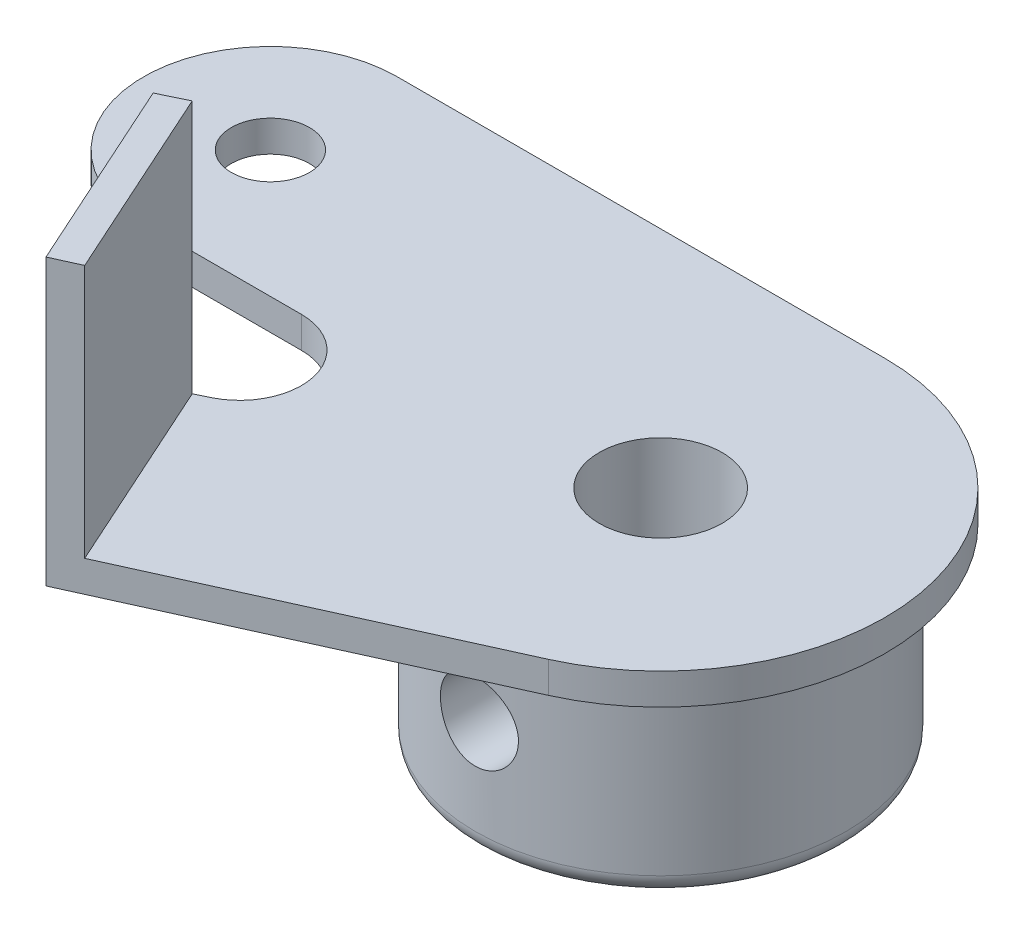
ISO-10303-21;
HEADER;
FILE_DESCRIPTION(('STEP AP214'),'2;1');
FILE_NAME('part.step','',(''),(''),'','','');
FILE_SCHEMA(('AUTOMOTIVE_DESIGN { 1 0 10303 214 1 1 1 1 }'));
ENDSEC;
DATA;
#1=APPLICATION_CONTEXT('core data for automotive mechanical design processes');
#2=APPLICATION_PROTOCOL_DEFINITION('international standard','automotive_design',2000,#1);
#3=PRODUCT_CONTEXT('',#1,'mechanical');
#4=PRODUCT('Part','Part','',(#3));
#5=PRODUCT_RELATED_PRODUCT_CATEGORY('part','',(#4));
#6=PRODUCT_DEFINITION_FORMATION('','',#4);
#7=PRODUCT_DEFINITION_CONTEXT('part definition',#1,'design');
#8=PRODUCT_DEFINITION('design','',#6,#7);
#9=PRODUCT_DEFINITION_SHAPE('','',#8);
#10=(LENGTH_UNIT() NAMED_UNIT(*) SI_UNIT(.MILLI.,.METRE.));
#11=(NAMED_UNIT(*) PLANE_ANGLE_UNIT() SI_UNIT($,.RADIAN.));
#12=(NAMED_UNIT(*) SI_UNIT($,.STERADIAN.) SOLID_ANGLE_UNIT());
#13=UNCERTAINTY_MEASURE_WITH_UNIT(LENGTH_MEASURE(1.E-05),#10,'distance_accuracy_value','');
#14=(GEOMETRIC_REPRESENTATION_CONTEXT(3) GLOBAL_UNCERTAINTY_ASSIGNED_CONTEXT((#13)) GLOBAL_UNIT_ASSIGNED_CONTEXT((#10,
#11,#12)) REPRESENTATION_CONTEXT('',''));
#15=CARTESIAN_POINT('',(0.,0.,0.));
#16=DIRECTION('',(0.,0.,1.));
#17=DIRECTION('',(1.,0.,0.));
#18=AXIS2_PLACEMENT_3D('',#15,#16,#17);
#19=CARTESIAN_POINT('',(0.,1.6,0.));
#20=DIRECTION('',(0.,-1.,0.));
#21=DIRECTION('',(0.,0.,-1.));
#22=AXIS2_PLACEMENT_3D('',#19,#20,#21);
#23=CYLINDRICAL_SURFACE('',#22,3.15);
#24=CARTESIAN_POINT('',(0.,-9.9,0.));
#25=DIRECTION('',(0.,1.,0.));
#26=DIRECTION('',(0.,0.,1.));
#27=AXIS2_PLACEMENT_3D('',#24,#25,#26);
#28=CIRCLE('',#27,3.15);
#29=CARTESIAN_POINT('',(0.,-9.9,3.15));
#30=VERTEX_POINT('',#29);
#31=EDGE_CURVE('E162',#30,#30,#28,.T.);
#32=ORIENTED_EDGE('',*,*,#31,.F.);
#33=EDGE_LOOP('',(#32));
#34=FACE_BOUND('',#33,.T.);
#35=CARTESIAN_POINT('',(0.,1.6,0.));
#36=DIRECTION('',(0.,1.,0.));
#37=DIRECTION('',(0.,0.,1.));
#38=AXIS2_PLACEMENT_3D('',#35,#36,#37);
#39=CIRCLE('',#38,3.15);
#40=CARTESIAN_POINT('',(0.,1.6,3.15));
#41=VERTEX_POINT('',#40);
#42=EDGE_CURVE('E170',#41,#41,#39,.T.);
#43=ORIENTED_EDGE('',*,*,#42,.T.);
#44=EDGE_LOOP('',(#43));
#45=FACE_BOUND('',#44,.T.);
#46=CARTESIAN_POINT('',(-2.,-4.,2.43361870472759));
#47=CARTESIAN_POINT('',(-1.99999048596303,-4.09897792412923,2.43363407140303));
#48=CARTESIAN_POINT('',(-1.99258494171125,-4.1980937936849,2.4397712297814));
#49=CARTESIAN_POINT('',(-1.96350941138464,-4.39293729178397,2.46321942053438));
#50=CARTESIAN_POINT('',(-1.94180331367139,-4.48865569450507,2.48055873835427));
#51=CARTESIAN_POINT('',(-1.88571217682298,-4.67329343053568,2.52345220456699));
#52=CARTESIAN_POINT('',(-1.851440143901,-4.76226508552795,2.5489328823773));
#53=CARTESIAN_POINT('',(-1.77151743183294,-4.93307511819181,2.60511197616351));
#54=CARTESIAN_POINT('',(-1.72586583679141,-5.01491292097222,2.6358108120648));
#55=CARTESIAN_POINT('',(-1.61708994740565,-5.18163300154651,2.70410628666589));
#56=CARTESIAN_POINT('',(-1.55241882997592,-5.26535664501788,2.74206853555775));
#57=CARTESIAN_POINT('',(-1.41059220491435,-5.42175437238425,2.81765858361404));
#58=CARTESIAN_POINT('',(-1.33342569379183,-5.49441860690431,2.85528605688028));
#59=CARTESIAN_POINT('',(-1.15704034741739,-5.63571807907852,2.93157022789516));
#60=CARTESIAN_POINT('',(-1.05626802714094,-5.70269215102644,2.96975927399976));
#61=CARTESIAN_POINT('',(-0.841996814394424,-5.81818709709045,3.03745228192605));
#62=CARTESIAN_POINT('',(-0.728511029226368,-5.86672675403408,3.0669650770146));
#63=CARTESIAN_POINT('',(-0.504499180886491,-5.9385134729046,3.11120961521296));
#64=CARTESIAN_POINT('',(-0.394895915515058,-5.96386827285645,3.12716069277187));
#65=CARTESIAN_POINT('',(-0.171964548656172,-5.99576167129526,3.14728504515542));
#66=CARTESIAN_POINT('',(-0.0586406758425458,-6.00232093093652,3.15147125251418));
#67=CARTESIAN_POINT('',(0.151552365513752,-5.99662936234425,3.1478620369092));
#68=CARTESIAN_POINT('',(0.248528717658883,-5.98685561615349,3.14164430808859));
#69=CARTESIAN_POINT('',(0.439138310744908,-5.95359030505218,3.12071260109803));
#70=CARTESIAN_POINT('',(0.532771299038607,-5.93009770577037,3.10599798228226));
#71=CARTESIAN_POINT('',(0.71448221653663,-5.87047576464673,3.06930433488698));
#72=CARTESIAN_POINT('',(0.802553648932606,-5.83433195506957,3.04731699091795));
#73=CARTESIAN_POINT('',(0.971433705071277,-5.75077179124807,2.9977610791413));
#74=CARTESIAN_POINT('',(1.05224075549125,-5.70335300313121,2.97019130647403));
#75=CARTESIAN_POINT('',(1.21525026488542,-5.5918894575377,2.90761365273554));
#76=CARTESIAN_POINT('',(1.29634063387077,-5.52650141596791,2.87210613999983));
#77=CARTESIAN_POINT('',(1.44710869319607,-5.3844238384735,2.79917994431847));
#78=CARTESIAN_POINT('',(1.51676911567106,-5.3077175294504,2.76175847971295));
#79=CARTESIAN_POINT('',(1.65238450119593,-5.13291104421371,2.68310715916129));
#80=CARTESIAN_POINT('',(1.71653615599839,-5.03331982460277,2.64205458619123));
#81=CARTESIAN_POINT('',(1.82699006644229,-4.82232618356503,2.56692053853577));
#82=CARTESIAN_POINT('',(1.87332485499188,-4.71094576777233,2.53282641194835));
#83=CARTESIAN_POINT('',(1.93594353840381,-4.50993207050804,2.48510313895072));
#84=CARTESIAN_POINT('',(1.95695691453044,-4.4224981757177,2.4684365697313));
#85=CARTESIAN_POINT('',(1.98705521670472,-4.24441139711935,2.44427838946132));
#86=CARTESIAN_POINT('',(1.99615746158439,-4.15376338421274,2.43677345842157));
#87=CARTESIAN_POINT('',(2.00187916764653,-3.97154888099231,2.43207683030032));
#88=CARTESIAN_POINT('',(1.99846473948857,-3.87998056753225,2.43491313236562));
#89=CARTESIAN_POINT('',(1.97931399694525,-3.69897745672697,2.45050151797388));
#90=CARTESIAN_POINT('',(1.96356738826233,-3.60954450617866,2.46326188557667));
#91=CARTESIAN_POINT('',(1.92117762173105,-3.43716644295216,2.4964515411222));
#92=CARTESIAN_POINT('',(1.89479801639248,-3.35411849446425,2.51669442404587));
#93=CARTESIAN_POINT('',(1.83219474854383,-3.19346113341894,2.56262885233369));
#94=CARTESIAN_POINT('',(1.79596764397219,-3.11585363445148,2.58832230217974));
#95=CARTESIAN_POINT('',(1.70664270614312,-2.95230993072988,2.64826132049625));
#96=CARTESIAN_POINT('',(1.65163646925486,-2.8676705292799,2.68319953585284));
#97=CARTESIAN_POINT('',(1.52987672919129,-2.70787617281957,2.75444460515898));
#98=CARTESIAN_POINT('',(1.46311080446709,-2.63273139239112,2.79075287408715));
#99=CARTESIAN_POINT('',(1.30608396864551,-2.48077221910152,2.86802362872114));
#100=CARTESIAN_POINT('',(1.21375656890451,-2.40592401395768,2.90870266544109));
#101=CARTESIAN_POINT('',(1.01546677917969,-2.27284680367282,2.98371307769469));
#102=CARTESIAN_POINT('',(0.909509417054113,-2.21461169560869,3.01804678258841));
#103=CARTESIAN_POINT('',(0.692269340715497,-2.12009871470208,3.07492813370973));
#104=CARTESIAN_POINT('',(0.581566442490211,-2.08282074982841,3.09800396720935));
#105=CARTESIAN_POINT('',(0.35364940279651,-2.02804419527675,3.13219438593408));
#106=CARTESIAN_POINT('',(0.236445246049434,-2.01051611015841,3.14332680684523));
#107=CARTESIAN_POINT('',(0.0184183325762331,-1.99757176308696,3.15154075684456));
#108=CARTESIAN_POINT('',(-0.0821686966634258,-1.99918404066731,3.15051062601086));
#109=CARTESIAN_POINT('',(-0.28141845177194,-2.01737468489518,3.13898890793604));
#110=CARTESIAN_POINT('',(-0.38008132255278,-2.03395192002236,3.12849803603419));
#111=CARTESIAN_POINT('',(-0.568457204796262,-2.08013872945793,3.09968712791156));
#112=CARTESIAN_POINT('',(-0.658372613948633,-2.10915783591322,3.08172279670887));
#113=CARTESIAN_POINT('',(-0.831943827649844,-2.17884042563895,3.03946637750989));
#114=CARTESIAN_POINT('',(-0.915598667382395,-2.21950569905817,3.01517331676755));
#115=CARTESIAN_POINT('',(-1.08344928980128,-2.31583060178368,2.95926218224012));
#116=CARTESIAN_POINT('',(-1.1668476075888,-2.37258931067717,2.92715228253863));
#117=CARTESIAN_POINT('',(-1.32350652343996,-2.4972131983284,2.85974121332081));
#118=CARTESIAN_POINT('',(-1.39675588258578,-2.56509051117597,2.82443657633822));
#119=CARTESIAN_POINT('',(-1.54245036284827,-2.72173939921906,2.74792336709905));
#120=CARTESIAN_POINT('',(-1.61312724346329,-2.81211786240157,2.70662345481368));
#121=CARTESIAN_POINT('',(-1.7386221852289,-3.00481645281769,2.62777208404518));
#122=CARTESIAN_POINT('',(-1.79344679580487,-3.10713162376317,2.59021908172396));
#123=CARTESIAN_POINT('',(-1.87534108446168,-3.29893211124449,2.53131778643174));
#124=CARTESIAN_POINT('',(-1.90584854100258,-3.38641034644393,2.50822135269557));
#125=CARTESIAN_POINT('',(-1.95462246620744,-3.5663246858754,2.47040933014862));
#126=CARTESIAN_POINT('',(-1.97292616984275,-3.65874477110976,2.45566826901342));
#127=CARTESIAN_POINT('',(-1.98972501700962,-3.79335049534013,2.44203397681219));
#128=CARTESIAN_POINT('',(-1.99357048045008,-3.83451094086341,2.43889105725654));
#129=CARTESIAN_POINT('',(-1.99871031223206,-3.91710614213742,2.43467992010628));
#130=CARTESIAN_POINT('',(-2.00000398515883,-3.95854096957691,2.43361226806538));
#131=CARTESIAN_POINT('',(-2.,-4.,2.43361870472759));
#132=B_SPLINE_CURVE_WITH_KNOTS('',3,(#46,#47,#48,#49,#50,#51,#52,#53,#54,#55,#56,#57,#58,#59,
#60,#61,#62,#63,#64,#65,#66,#67,#68,#69,#70,#71,#72,#73,#74,#75,#76,#77,#78,#79,#80,#81,#82,#83,
#84,#85,#86,#87,#88,#89,#90,#91,#92,#93,#94,#95,#96,#97,#98,#99,#100,#101,#102,#103,#104,#105,
#106,#107,#108,#109,#110,#111,#112,#113,#114,#115,#116,#117,#118,#119,#120,#121,#122,#123,#124,
#125,#126,#127,#128,#129,#130,#131),.UNSPECIFIED.,.T.,.F.,(4,2,2,2,2,2,2,2,2,2,2,2,2,2,2,2,2,2,
2,2,2,2,2,2,2,2,2,2,2,2,2,2,2,2,2,2,2,2,2,2,2,2,4),(0.,0.296743535927673,0.594239293109833,
0.889122768316478,1.18402998518316,1.51993870440622,1.85614485104264,2.23471138765325,
2.61289116127746,2.95168264677021,3.29010156976508,3.5816951499518,3.87331071849013,
4.16526086971039,4.45727410003803,4.78615817426407,5.11553462634661,5.48986491382257,
5.86350840566245,6.13674202691223,6.4095779223354,6.68315307564917,6.95695683976678,
7.22435474797717,7.49184624200052,7.81112947271865,8.13075200158783,8.50574828386312,
8.88060663103731,9.2355988873744,9.59006027521556,9.89031729141086,10.1905516066751,
10.4778877674234,10.7652681187458,11.0816516893217,11.398382868429,11.762616691235,
12.1266998137276,12.4120863063782,12.6965980198832,12.8208615668584,12.9451589734985),.UNSPECIFIED.);
#133=CARTESIAN_POINT('',(-2.,-4.,2.43361870472759));
#134=VERTEX_POINT('',#133);
#135=EDGE_CURVE('E154',#134,#134,#132,.T.);
#136=ORIENTED_EDGE('',*,*,#135,.T.);
#137=EDGE_LOOP('',(#136));
#138=FACE_BOUND('',#137,.T.);
#139=ADVANCED_FACE('F32',(#34,#45,#138),#23,.F.);
#140=CARTESIAN_POINT('',(0.,-9.9,0.));
#141=DIRECTION('',(0.,1.,0.));
#142=DIRECTION('',(0.,0.,1.));
#143=AXIS2_PLACEMENT_3D('',#140,#141,#142);
#144=CYLINDRICAL_SURFACE('',#143,9.5);
#145=CARTESIAN_POINT('',(0.,0.,0.));
#146=DIRECTION('',(0.,1.,0.));
#147=DIRECTION('',(0.,0.,1.));
#148=AXIS2_PLACEMENT_3D('',#145,#146,#147);
#149=CIRCLE('',#148,9.5);
#150=CARTESIAN_POINT('',(0.,0.,9.5));
#151=VERTEX_POINT('',#150);
#152=EDGE_CURVE('E165',#151,#151,#149,.T.);
#153=ORIENTED_EDGE('',*,*,#152,.F.);
#154=EDGE_LOOP('',(#153));
#155=FACE_BOUND('',#154,.T.);
#156=CARTESIAN_POINT('',(0.,-8.9,0.));
#157=DIRECTION('',(0.,1.,0.));
#158=DIRECTION('',(0.,0.,1.));
#159=AXIS2_PLACEMENT_3D('',#156,#157,#158);
#160=CIRCLE('',#159,9.5);
#161=CARTESIAN_POINT('',(0.,-8.9,9.5));
#162=VERTEX_POINT('',#161);
#163=EDGE_CURVE('E46',#162,#162,#160,.T.);
#164=ORIENTED_EDGE('',*,*,#163,.T.);
#165=EDGE_LOOP('',(#164));
#166=FACE_BOUND('',#165,.T.);
#167=CARTESIAN_POINT('',(0.,-6.,9.5));
#168=CARTESIAN_POINT('',(-0.111027691406918,-5.99999607124184,9.49999794466284));
#169=CARTESIAN_POINT('',(-0.222103819697907,-5.99072341258494,9.49803374011152));
#170=CARTESIAN_POINT('',(-0.441107897677742,-5.95391221577523,9.49038773876543));
#171=CARTESIAN_POINT('',(-0.549033421548031,-5.92635997129166,9.48470315241122));
#172=CARTESIAN_POINT('',(-0.758538954356631,-5.85388532469072,9.47025014436966));
#173=CARTESIAN_POINT('',(-0.860125227252474,-5.80898039524809,9.46148482551806));
#174=CARTESIAN_POINT('',(-1.05431669556347,-5.70312896009559,9.44181943917345));
#175=CARTESIAN_POINT('',(-1.14692225767425,-5.64218310973783,9.43091945889674));
#176=CARTESIAN_POINT('',(-1.32191105664779,-5.5050163164218,9.40799939900276));
#177=CARTESIAN_POINT('',(-1.40414098477697,-5.42860195147082,9.39596628673028));
#178=CARTESIAN_POINT('',(-1.5547158009156,-5.26308274811662,9.37222932526175));
#179=CARTESIAN_POINT('',(-1.62305952179987,-5.17397684406892,9.36052550381352));
#180=CARTESIAN_POINT('',(-1.74458761331518,-4.98448418595307,9.33864435582616));
#181=CARTESIAN_POINT('',(-1.79761077433325,-4.88399193875563,9.3284837610875));
#182=CARTESIAN_POINT('',(-1.88595912909311,-4.67527480153637,9.31102569552844));
#183=CARTESIAN_POINT('',(-1.92128627263874,-4.56705076492994,9.30372790929388));
#184=CARTESIAN_POINT('',(-1.97273711798377,-4.34759918793632,9.29295410063532));
#185=CARTESIAN_POINT('',(-1.98913117149676,-4.23643772602986,9.28942433018121));
#186=CARTESIAN_POINT('',(-2.00309070126667,-4.01289040972181,9.28642462929545));
#187=CARTESIAN_POINT('',(-2.0006583162811,-3.90050469584858,9.28695423770231));
#188=CARTESIAN_POINT('',(-1.97725203465241,-3.67969454311813,9.29196471678557));
#189=CARTESIAN_POINT('',(-1.95659032965632,-3.57123527450766,9.29637905513068));
#190=CARTESIAN_POINT('',(-1.89780570602233,-3.35935778687936,9.30855661318396));
#191=CARTESIAN_POINT('',(-1.85968187273537,-3.25593983223457,9.31632000831117));
#192=CARTESIAN_POINT('',(-1.76676342524457,-3.05619311586893,9.3343876042841));
#193=CARTESIAN_POINT('',(-1.71184711583088,-2.95992270171329,9.34471024508934));
#194=CARTESIAN_POINT('',(-1.58698828724243,-2.77784720736976,9.36672168799341));
#195=CARTESIAN_POINT('',(-1.51704386320572,-2.6920434560286,9.37841066319381));
#196=CARTESIAN_POINT('',(-1.36245319268555,-2.5315377182517,9.40212443418224));
#197=CARTESIAN_POINT('',(-1.27754103078861,-2.45709191372292,9.41415127237563));
#198=CARTESIAN_POINT('',(-1.09630350618647,-2.32345749428508,9.43697235772124));
#199=CARTESIAN_POINT('',(-0.999977965203844,-2.26426911774351,9.44776658561488));
#200=CARTESIAN_POINT('',(-0.798347946602956,-2.16277357067253,9.4669373217246));
#201=CARTESIAN_POINT('',(-0.693027080487019,-2.12049804546326,9.47530928967255));
#202=CARTESIAN_POINT('',(-0.476561722422704,-2.05431411167283,9.48865817597072));
#203=CARTESIAN_POINT('',(-0.36541801587004,-2.0304032328119,9.49363555092699));
#204=CARTESIAN_POINT('',(-0.142661179143838,-2.00199549360385,9.49957007213675));
#205=CARTESIAN_POINT('',(-0.0310945881093398,-1.9971484028368,9.50059973479178));
#206=CARTESIAN_POINT('',(0.191254168004883,-2.00605926966534,9.49872522451051));
#207=CARTESIAN_POINT('',(0.302036381746439,-2.01981606274954,9.49582129779749));
#208=CARTESIAN_POINT('',(0.518524951939024,-2.06525350407423,9.48645148769872));
#209=CARTESIAN_POINT('',(0.624271191689803,-2.0967522431248,9.48002177185877));
#210=CARTESIAN_POINT('',(0.828980163564159,-2.17657893621449,9.46431934896414));
#211=CARTESIAN_POINT('',(0.927942347168736,-2.22490824915882,9.45504641235425));
#212=CARTESIAN_POINT('',(1.1177352139125,-2.33776641280824,9.43450639350328));
#213=CARTESIAN_POINT('',(1.20843942082223,-2.40250330603654,9.42321429613729));
#214=CARTESIAN_POINT('',(1.3778228093732,-2.5460629854693,9.39994292264559));
#215=CARTESIAN_POINT('',(1.45650054987901,-2.62488745734182,9.38796356440136));
#216=CARTESIAN_POINT('',(1.60096761890465,-2.7959863577544,9.36442002668555));
#217=CARTESIAN_POINT('',(1.66651533299618,-2.88846649855883,9.35286635532256));
#218=CARTESIAN_POINT('',(1.78114871532168,-3.08332921929841,9.3317158615554));
#219=CARTESIAN_POINT('',(1.83023507526625,-3.1857113829149,9.32211895693401));
#220=CARTESIAN_POINT('',(1.91023404895235,-3.39693504714075,9.30605568943114));
#221=CARTESIAN_POINT('',(1.94124569603787,-3.50573768219553,9.29957230236649));
#222=CARTESIAN_POINT('',(1.98450997561557,-3.72716231931549,9.29043690813401));
#223=CARTESIAN_POINT('',(1.99676535636039,-3.83978375935983,9.2877843396606));
#224=CARTESIAN_POINT('',(2.00205901839309,-4.06321772699636,9.28664441918933));
#225=CARTESIAN_POINT('',(1.99547977904067,-4.17402094367414,9.28807416506268));
#226=CARTESIAN_POINT('',(1.96414112828371,-4.39290256994455,9.29475130102582));
#227=CARTESIAN_POINT('',(1.93938189936145,-4.50098100687599,9.29999865279627));
#228=CARTESIAN_POINT('',(1.87256463307709,-4.71106838455512,9.31368082515299));
#229=CARTESIAN_POINT('',(1.83055834216923,-4.81309444519955,9.32210610488688));
#230=CARTESIAN_POINT('',(1.7304853373043,-5.00870903307655,9.34119928093713));
#231=CARTESIAN_POINT('',(1.67241709412298,-5.10229675578741,9.35186739076535));
#232=CARTESIAN_POINT('',(1.54058300352461,-5.28027215313688,9.37449454781844));
#233=CARTESIAN_POINT('',(1.46654292423916,-5.36445412742039,9.38647407045747));
#234=CARTESIAN_POINT('',(1.30542742412966,-5.51932471088921,9.41023256612317));
#235=CARTESIAN_POINT('',(1.21834900426412,-5.59001020712048,9.42201149231316));
#236=CARTESIAN_POINT('',(1.0323889870608,-5.71667699825411,9.44420645110714));
#237=CARTESIAN_POINT('',(0.933379984354338,-5.77247451681065,9.45460471891947));
#238=CARTESIAN_POINT('',(0.727194538068344,-5.86654901797898,9.47269018370409));
#239=CARTESIAN_POINT('',(0.620025269870786,-5.90484119029407,9.48037972974824));
#240=CARTESIAN_POINT('',(0.427239257105932,-5.95572669428031,9.49075437069452));
#241=CARTESIAN_POINT('',(0.34269090067951,-5.97229845081316,9.4942005429971));
#242=CARTESIAN_POINT('',(0.172104693356146,-5.99443641509507,9.49882411071615));
#243=CARTESIAN_POINT('',(0.0860668997910729,-6.00000304551082,9.50000159326466));
#244=CARTESIAN_POINT('',(0.,-6.,9.5));
#245=B_SPLINE_CURVE_WITH_KNOTS('',3,(#167,#168,#169,#170,#171,#172,#173,#174,#175,#176,#177,
#178,#179,#180,#181,#182,#183,#184,#185,#186,#187,#188,#189,#190,#191,#192,#193,#194,#195,#196,
#197,#198,#199,#200,#201,#202,#203,#204,#205,#206,#207,#208,#209,#210,#211,#212,#213,#214,#215,
#216,#217,#218,#219,#220,#221,#222,#223,#224,#225,#226,#227,#228,#229,#230,#231,#232,#233,#234,
#235,#236,#237,#238,#239,#240,#241,#242,#243,#244),.UNSPECIFIED.,.T.,.F.,(4,2,2,2,2,2,2,2,2,2,2,
2,2,2,2,2,2,2,2,2,2,2,2,2,2,2,2,2,2,2,2,2,2,2,2,2,2,2,4),(0.,0.332768117031277,
0.665786031430695,0.998469495255918,1.33113936940165,1.6682591973254,2.00540734820485,
2.34598369082387,2.68652249939278,3.02213605752824,3.35771148920196,3.68764911424788,
4.01760402307771,4.35000918418411,4.68245650359801,5.02154876866119,5.36064633105725,
5.70037543797721,6.04005883898083,6.37347176163493,6.7068638152502,7.03689822691305,
7.36695929182639,7.70143535229664,8.03595146177539,8.37614947767226,8.71633319656386,
9.05463505055367,9.39288733028468,9.72431965754211,10.0557486580815,10.3861904535976,
10.7166637206083,11.0533410961237,11.3900960325031,11.7308334079191,12.0712745555643,
12.329241012877,12.5871975624483),.UNSPECIFIED.);
#246=CARTESIAN_POINT('',(0.,-6.,9.5));
#247=VERTEX_POINT('',#246);
#248=EDGE_CURVE('E36',#247,#247,#245,.T.);
#249=ORIENTED_EDGE('',*,*,#248,.T.);
#250=EDGE_LOOP('',(#249));
#251=FACE_BOUND('',#250,.T.);
#252=ADVANCED_FACE('F199',(#155,#166,#251),#144,.T.);
#253=CARTESIAN_POINT('',(0.,1.6,0.));
#254=DIRECTION('',(0.,1.,0.));
#255=DIRECTION('',(0.,0.,1.));
#256=AXIS2_PLACEMENT_3D('',#253,#254,#255);
#257=PLANE('',#256);
#258=DIRECTION('',(-0.412042177364769,0.,-0.911164773283351));
#259=VECTOR('',#258,1.);
#260=CARTESIAN_POINT('',(-16.1820359982028,1.6,7.82423700244424));
#261=LINE('',#260,#259);
#262=CARTESIAN_POINT('',(-11.6337033913184,1.6,17.8821404798842));
#263=VERTEX_POINT('',#262);
#264=CARTESIAN_POINT('',(-16.1820359982028,1.6,7.82423700244424));
#265=VERTEX_POINT('',#264);
#266=EDGE_CURVE('E54',#263,#265,#261,.T.);
#267=ORIENTED_EDGE('',*,*,#266,.F.);
#268=DIRECTION('',(0.911164773283351,0.,-0.412042177364769));
#269=VECTOR('',#268,1.);
#270=CARTESIAN_POINT('',(4.73848503969484,1.6,10.4783948927585));
#271=LINE('',#270,#269);
#272=CARTESIAN_POINT('',(4.73848503969484,1.6,10.4783948927585));
#273=VERTEX_POINT('',#272);
#274=EDGE_CURVE('E59',#263,#273,#271,.T.);
#275=ORIENTED_EDGE('',*,*,#274,.T.);
#276=CARTESIAN_POINT('',(0.,1.6,0.));
#277=DIRECTION('',(0.,1.,0.));
#278=DIRECTION('',(0.,0.,1.));
#279=AXIS2_PLACEMENT_3D('',#276,#277,#278);
#280=CIRCLE('',#279,11.5);
#281=CARTESIAN_POINT('',(0.,1.6,-11.5));
#282=VERTEX_POINT('',#281);
#283=EDGE_CURVE('E177',#273,#282,#280,.T.);
#284=ORIENTED_EDGE('',*,*,#283,.T.);
#285=DIRECTION('',(-1.,0.,0.));
#286=VECTOR('',#285,1.);
#287=CARTESIAN_POINT('',(0.,1.6,-11.5));
#288=LINE('',#287,#286);
#289=CARTESIAN_POINT('',(-25.,1.6,-11.5));
#290=VERTEX_POINT('',#289);
#291=EDGE_CURVE('E102',#282,#290,#288,.T.);
#292=ORIENTED_EDGE('',*,*,#291,.T.);
#293=CARTESIAN_POINT('',(-25.,1.6,-4.99999999999999));
#294=DIRECTION('',(0.,1.,0.));
#295=DIRECTION('',(0.,0.,1.));
#296=AXIS2_PLACEMENT_3D('',#293,#294,#295);
#297=CIRCLE('',#296,6.50000000000001);
#298=CARTESIAN_POINT('',(-25.,1.6,1.50000000000001));
#299=VERTEX_POINT('',#298);
#300=EDGE_CURVE('E120',#290,#299,#297,.T.);
#301=ORIENTED_EDGE('',*,*,#300,.T.);
#302=DIRECTION('',(1.,0.,0.));
#303=VECTOR('',#302,1.);
#304=CARTESIAN_POINT('',(-25.,1.6,1.50000000000001));
#305=LINE('',#304,#303);
#306=CARTESIAN_POINT('',(-16.9092175399438,1.6,1.50000000000001));
#307=VERTEX_POINT('',#306);
#308=EDGE_CURVE('E112',#299,#307,#305,.T.);
#309=ORIENTED_EDGE('',*,*,#308,.T.);
#310=CARTESIAN_POINT('',(-16.9092175399438,1.6,4.66276717832938));
#311=DIRECTION('',(0.,-1.,0.));
#312=DIRECTION('',(0.,0.,-1.));
#313=AXIS2_PLACEMENT_3D('',#310,#311,#312);
#314=CIRCLE('',#313,3.16276717832936);
#315=CARTESIAN_POINT('',(-15.5324639510125,1.6,7.51015998222599));
#316=VERTEX_POINT('',#315);
#317=EDGE_CURVE('E117',#307,#316,#314,.T.);
#318=ORIENTED_EDGE('',*,*,#317,.T.);
#319=DIRECTION('',(-0.90028530187311,0.,0.435300327625931));
#320=VECTOR('',#319,1.);
#321=CARTESIAN_POINT('',(-15.5324639510125,1.6,7.51015998222599));
#322=LINE('',#321,#320);
#323=EDGE_CURVE('E138',#316,#265,#322,.T.);
#324=ORIENTED_EDGE('',*,*,#323,.T.);
#325=EDGE_LOOP('',(#267,#275,#284,#292,#301,#309,#318,#324));
#326=FACE_BOUND('',#325,.T.);
#327=CARTESIAN_POINT('',(-25.,1.6,-4.99999999999999));
#328=DIRECTION('',(0.,1.,0.));
#329=DIRECTION('',(0.,0.,1.));
#330=AXIS2_PLACEMENT_3D('',#327,#328,#329);
#331=CIRCLE('',#330,2.);
#332=CARTESIAN_POINT('',(-25.,1.6,-2.99999999999999));
#333=VERTEX_POINT('',#332);
#334=EDGE_CURVE('E167',#333,#333,#331,.T.);
#335=ORIENTED_EDGE('',*,*,#334,.F.);
#336=EDGE_LOOP('',(#335));
#337=FACE_BOUND('',#336,.T.);
#338=ORIENTED_EDGE('',*,*,#42,.F.);
#339=EDGE_LOOP('',(#338));
#340=FACE_BOUND('',#339,.T.);
#341=ADVANCED_FACE('F114',(#326,#337,#340),#257,.T.);
#342=CARTESIAN_POINT('',(0.,0.,0.));
#343=DIRECTION('',(0.,1.,0.));
#344=DIRECTION('',(0.,0.,1.));
#345=AXIS2_PLACEMENT_3D('',#342,#343,#344);
#346=PLANE('',#345);
#347=ORIENTED_EDGE('',*,*,#152,.T.);
#348=EDGE_LOOP('',(#347));
#349=FACE_BOUND('',#348,.T.);
#350=CARTESIAN_POINT('',(0.,0.,0.));
#351=DIRECTION('',(0.,1.,0.));
#352=DIRECTION('',(0.,0.,1.));
#353=AXIS2_PLACEMENT_3D('',#350,#351,#352);
#354=CIRCLE('',#353,11.5);
#355=CARTESIAN_POINT('',(4.73848503969484,0.,10.4783948927585));
#356=VERTEX_POINT('',#355);
#357=CARTESIAN_POINT('',(0.,0.,-11.5));
#358=VERTEX_POINT('',#357);
#359=EDGE_CURVE('E176',#356,#358,#354,.T.);
#360=ORIENTED_EDGE('',*,*,#359,.F.);
#361=DIRECTION('',(0.911164773283351,0.,-0.412042177364769));
#362=VECTOR('',#361,1.);
#363=CARTESIAN_POINT('',(4.73848503969484,0.,10.4783948927585));
#364=LINE('',#363,#362);
#365=CARTESIAN_POINT('',(-13.,0.,18.5));
#366=VERTEX_POINT('',#365);
#367=EDGE_CURVE('E93',#366,#356,#364,.T.);
#368=ORIENTED_EDGE('',*,*,#367,.F.);
#369=DIRECTION('',(0.412042177364769,0.,0.911164773283351));
#370=VECTOR('',#369,1.);
#371=CARTESIAN_POINT('',(-17.5324639510125,0.,8.47718749388314));
#372=LINE('',#371,#370);
#373=CARTESIAN_POINT('',(-17.5324639510125,0.,8.47718749388314));
#374=VERTEX_POINT('',#373);
#375=EDGE_CURVE('E280',#374,#366,#372,.T.);
#376=ORIENTED_EDGE('',*,*,#375,.F.);
#377=DIRECTION('',(-0.90028530187311,0.,0.435300327625931));
#378=VECTOR('',#377,1.);
#379=CARTESIAN_POINT('',(-15.5324639510125,0.,7.51015998222599));
#380=LINE('',#379,#378);
#381=CARTESIAN_POINT('',(-15.5324639510125,0.,7.51015998222599));
#382=VERTEX_POINT('',#381);
#383=EDGE_CURVE('E288',#382,#374,#380,.T.);
#384=ORIENTED_EDGE('',*,*,#383,.F.);
#385=CARTESIAN_POINT('',(-16.9092175399438,0.,4.66276717832938));
#386=DIRECTION('',(0.,-1.,0.));
#387=DIRECTION('',(0.,0.,-1.));
#388=AXIS2_PLACEMENT_3D('',#385,#386,#387);
#389=CIRCLE('',#388,3.16276717832936);
#390=CARTESIAN_POINT('',(-16.9092175399438,0.,1.50000000000001));
#391=VERTEX_POINT('',#390);
#392=EDGE_CURVE('E293',#391,#382,#389,.T.);
#393=ORIENTED_EDGE('',*,*,#392,.F.);
#394=DIRECTION('',(1.,0.,0.));
#395=VECTOR('',#394,1.);
#396=CARTESIAN_POINT('',(-25.,0.,1.50000000000001));
#397=LINE('',#396,#395);
#398=CARTESIAN_POINT('',(-25.,0.,1.50000000000001));
#399=VERTEX_POINT('',#398);
#400=EDGE_CURVE('E129',#399,#391,#397,.T.);
#401=ORIENTED_EDGE('',*,*,#400,.F.);
#402=CARTESIAN_POINT('',(-25.,0.,-4.99999999999999));
#403=DIRECTION('',(0.,1.,0.));
#404=DIRECTION('',(0.,0.,1.));
#405=AXIS2_PLACEMENT_3D('',#402,#403,#404);
#406=CIRCLE('',#405,6.50000000000001);
#407=CARTESIAN_POINT('',(-25.,0.,-11.5));
#408=VERTEX_POINT('',#407);
#409=EDGE_CURVE('E190',#408,#399,#406,.T.);
#410=ORIENTED_EDGE('',*,*,#409,.F.);
#411=DIRECTION('',(-1.,0.,0.));
#412=VECTOR('',#411,1.);
#413=CARTESIAN_POINT('',(0.,0.,-11.5));
#414=LINE('',#413,#412);
#415=EDGE_CURVE('E184',#358,#408,#414,.T.);
#416=ORIENTED_EDGE('',*,*,#415,.F.);
#417=EDGE_LOOP('',(#360,#368,#376,#384,#393,#401,#410,#416));
#418=FACE_BOUND('',#417,.T.);
#419=CARTESIAN_POINT('',(-25.,0.,-4.99999999999999));
#420=DIRECTION('',(0.,1.,0.));
#421=DIRECTION('',(0.,0.,1.));
#422=AXIS2_PLACEMENT_3D('',#419,#420,#421);
#423=CIRCLE('',#422,2.);
#424=CARTESIAN_POINT('',(-25.,0.,-2.99999999999999));
#425=VERTEX_POINT('',#424);
#426=EDGE_CURVE('E171',#425,#425,#423,.T.);
#427=ORIENTED_EDGE('',*,*,#426,.T.);
#428=EDGE_LOOP('',(#427));
#429=FACE_BOUND('',#428,.T.);
#430=ADVANCED_FACE('F291',(#349,#418,#429),#346,.F.);
#431=CARTESIAN_POINT('',(0.,1.6,0.));
#432=DIRECTION('',(0.,-1.,0.));
#433=DIRECTION('',(0.,0.,-1.));
#434=AXIS2_PLACEMENT_3D('',#431,#432,#433);
#435=CYLINDRICAL_SURFACE('',#434,11.5);
#436=ORIENTED_EDGE('',*,*,#359,.T.);
#437=DIRECTION('',(0.,-1.,0.));
#438=VECTOR('',#437,1.);
#439=CARTESIAN_POINT('',(0.,1.6,-11.5));
#440=LINE('',#439,#438);
#441=EDGE_CURVE('E187',#282,#358,#440,.T.);
#442=ORIENTED_EDGE('',*,*,#441,.F.);
#443=ORIENTED_EDGE('',*,*,#283,.F.);
#444=DIRECTION('',(0.,-1.,0.));
#445=VECTOR('',#444,1.);
#446=CARTESIAN_POINT('',(4.73848503969484,1.6,10.4783948927585));
#447=LINE('',#446,#445);
#448=EDGE_CURVE('E150',#273,#356,#447,.T.);
#449=ORIENTED_EDGE('',*,*,#448,.T.);
#450=EDGE_LOOP('',(#436,#442,#443,#449));
#451=FACE_BOUND('',#450,.T.);
#452=ADVANCED_FACE('F302',(#451),#435,.T.);
#453=CARTESIAN_POINT('',(0.,1.6,-11.5));
#454=DIRECTION('',(0.,0.,1.));
#455=DIRECTION('',(1.,0.,0.));
#456=AXIS2_PLACEMENT_3D('',#453,#454,#455);
#457=PLANE('',#456);
#458=ORIENTED_EDGE('',*,*,#415,.T.);
#459=DIRECTION('',(0.,-1.,0.));
#460=VECTOR('',#459,1.);
#461=CARTESIAN_POINT('',(-25.,1.6,-11.5));
#462=LINE('',#461,#460);
#463=EDGE_CURVE('E182',#290,#408,#462,.T.);
#464=ORIENTED_EDGE('',*,*,#463,.F.);
#465=ORIENTED_EDGE('',*,*,#291,.F.);
#466=ORIENTED_EDGE('',*,*,#441,.T.);
#467=EDGE_LOOP('',(#458,#464,#465,#466));
#468=FACE_BOUND('',#467,.T.);
#469=ADVANCED_FACE('F183',(#468),#457,.F.);
#470=CARTESIAN_POINT('',(-25.,1.6,-4.99999999999999));
#471=DIRECTION('',(0.,-1.,0.));
#472=DIRECTION('',(0.,0.,-1.));
#473=AXIS2_PLACEMENT_3D('',#470,#471,#472);
#474=CYLINDRICAL_SURFACE('',#473,6.50000000000001);
#475=ORIENTED_EDGE('',*,*,#409,.T.);
#476=DIRECTION('',(0.,-1.,0.));
#477=VECTOR('',#476,1.);
#478=CARTESIAN_POINT('',(-25.,1.6,1.50000000000001));
#479=LINE('',#478,#477);
#480=EDGE_CURVE('E132',#299,#399,#479,.T.);
#481=ORIENTED_EDGE('',*,*,#480,.F.);
#482=ORIENTED_EDGE('',*,*,#300,.F.);
#483=ORIENTED_EDGE('',*,*,#463,.T.);
#484=EDGE_LOOP('',(#475,#481,#482,#483));
#485=FACE_BOUND('',#484,.T.);
#486=ADVANCED_FACE('F189',(#485),#474,.T.);
#487=CARTESIAN_POINT('',(-25.,1.6,1.50000000000001));
#488=DIRECTION('',(0.,0.,-1.));
#489=DIRECTION('',(-1.,0.,0.));
#490=AXIS2_PLACEMENT_3D('',#487,#488,#489);
#491=PLANE('',#490);
#492=ORIENTED_EDGE('',*,*,#400,.T.);
#493=DIRECTION('',(0.,-1.,0.));
#494=VECTOR('',#493,1.);
#495=CARTESIAN_POINT('',(-16.9092175399438,1.6,1.50000000000001));
#496=LINE('',#495,#494);
#497=EDGE_CURVE('E126',#307,#391,#496,.T.);
#498=ORIENTED_EDGE('',*,*,#497,.F.);
#499=ORIENTED_EDGE('',*,*,#308,.F.);
#500=ORIENTED_EDGE('',*,*,#480,.T.);
#501=EDGE_LOOP('',(#492,#498,#499,#500));
#502=FACE_BOUND('',#501,.T.);
#503=ADVANCED_FACE('F127',(#502),#491,.F.);
#504=CARTESIAN_POINT('',(-16.9092175399438,1.6,4.66276717832938));
#505=DIRECTION('',(0.,-1.,0.));
#506=DIRECTION('',(0.,0.,-1.));
#507=AXIS2_PLACEMENT_3D('',#504,#505,#506);
#508=CYLINDRICAL_SURFACE('',#507,3.16276717832936);
#509=ORIENTED_EDGE('',*,*,#392,.T.);
#510=DIRECTION('',(0.,-1.,0.));
#511=VECTOR('',#510,1.);
#512=CARTESIAN_POINT('',(-15.5324639510125,1.6,7.51015998222599));
#513=LINE('',#512,#511);
#514=EDGE_CURVE('E133',#316,#382,#513,.T.);
#515=ORIENTED_EDGE('',*,*,#514,.F.);
#516=ORIENTED_EDGE('',*,*,#317,.F.);
#517=ORIENTED_EDGE('',*,*,#497,.T.);
#518=EDGE_LOOP('',(#509,#515,#516,#517));
#519=FACE_BOUND('',#518,.T.);
#520=ADVANCED_FACE('F135',(#519),#508,.F.);
#521=CARTESIAN_POINT('',(-15.5324639510125,1.6,7.51015998222599));
#522=DIRECTION('',(0.435300327625931,0.,0.90028530187311));
#523=DIRECTION('',(0.90028530187311,0.,-0.435300327625931));
#524=AXIS2_PLACEMENT_3D('',#521,#522,#523);
#525=PLANE('',#524);
#526=ORIENTED_EDGE('',*,*,#383,.T.);
#527=DIRECTION('',(0.,-1.,0.));
#528=VECTOR('',#527,1.);
#529=CARTESIAN_POINT('',(-17.5324639510125,1.6,8.47718749388314));
#530=LINE('',#529,#528);
#531=CARTESIAN_POINT('',(-17.5324639510125,14.6,8.47718749388314));
#532=VERTEX_POINT('',#531);
#533=EDGE_CURVE('E281',#532,#374,#530,.T.);
#534=ORIENTED_EDGE('',*,*,#533,.F.);
#535=DIRECTION('',(-0.90028530187311,0.,0.435300327625931));
#536=VECTOR('',#535,1.);
#537=CARTESIAN_POINT('',(-16.1820359982028,14.6,7.82423700244424));
#538=LINE('',#537,#536);
#539=CARTESIAN_POINT('',(-16.1820359982028,14.6,7.82423700244424));
#540=VERTEX_POINT('',#539);
#541=EDGE_CURVE('E153',#540,#532,#538,.T.);
#542=ORIENTED_EDGE('',*,*,#541,.F.);
#543=DIRECTION('',(0.,-1.,0.));
#544=VECTOR('',#543,1.);
#545=CARTESIAN_POINT('',(-16.1820359982028,14.6,7.82423700244424));
#546=LINE('',#545,#544);
#547=EDGE_CURVE('E155',#540,#265,#546,.T.);
#548=ORIENTED_EDGE('',*,*,#547,.T.);
#549=ORIENTED_EDGE('',*,*,#323,.F.);
#550=ORIENTED_EDGE('',*,*,#514,.T.);
#551=EDGE_LOOP('',(#526,#534,#542,#548,#549,#550));
#552=FACE_BOUND('',#551,.T.);
#553=ADVANCED_FACE('F287',(#552),#525,.F.);
#554=CARTESIAN_POINT('',(-17.5324639510125,1.6,8.47718749388314));
#555=DIRECTION('',(0.911164773283351,0.,-0.412042177364769));
#556=DIRECTION('',(-0.412042177364769,0.,-0.911164773283351));
#557=AXIS2_PLACEMENT_3D('',#554,#555,#556);
#558=PLANE('',#557);
#559=ORIENTED_EDGE('',*,*,#375,.T.);
#560=DIRECTION('',(0.,-1.,0.));
#561=VECTOR('',#560,1.);
#562=CARTESIAN_POINT('',(-13.,1.6,18.5));
#563=LINE('',#562,#561);
#564=CARTESIAN_POINT('',(-13.,14.6,18.5));
#565=VERTEX_POINT('',#564);
#566=EDGE_CURVE('E276',#565,#366,#563,.T.);
#567=ORIENTED_EDGE('',*,*,#566,.F.);
#568=DIRECTION('',(0.412042177364769,0.,0.911164773283351));
#569=VECTOR('',#568,1.);
#570=CARTESIAN_POINT('',(-17.5324639510125,14.6,8.47718749388314));
#571=LINE('',#570,#569);
#572=EDGE_CURVE('E256',#532,#565,#571,.T.);
#573=ORIENTED_EDGE('',*,*,#572,.F.);
#574=ORIENTED_EDGE('',*,*,#533,.T.);
#575=EDGE_LOOP('',(#559,#567,#573,#574));
#576=FACE_BOUND('',#575,.T.);
#577=ADVANCED_FACE('F277',(#576),#558,.F.);
#578=CARTESIAN_POINT('',(4.73848503969484,1.6,10.4783948927585));
#579=DIRECTION('',(-0.412042177364769,0.,-0.911164773283351));
#580=DIRECTION('',(-0.911164773283351,0.,0.412042177364769));
#581=AXIS2_PLACEMENT_3D('',#578,#579,#580);
#582=PLANE('',#581);
#583=ORIENTED_EDGE('',*,*,#367,.T.);
#584=ORIENTED_EDGE('',*,*,#448,.F.);
#585=ORIENTED_EDGE('',*,*,#274,.F.);
#586=DIRECTION('',(0.,-1.,0.));
#587=VECTOR('',#586,1.);
#588=CARTESIAN_POINT('',(-11.6337033913184,14.6,17.8821404798842));
#589=LINE('',#588,#587);
#590=CARTESIAN_POINT('',(-11.6337033913184,14.6,17.8821404798842));
#591=VERTEX_POINT('',#590);
#592=EDGE_CURVE('E166',#591,#263,#589,.T.);
#593=ORIENTED_EDGE('',*,*,#592,.F.);
#594=DIRECTION('',(0.911164773283351,0.,-0.412042177364768));
#595=VECTOR('',#594,1.);
#596=CARTESIAN_POINT('',(-13.,14.6,18.5));
#597=LINE('',#596,#595);
#598=EDGE_CURVE('E264',#565,#591,#597,.T.);
#599=ORIENTED_EDGE('',*,*,#598,.F.);
#600=ORIENTED_EDGE('',*,*,#566,.T.);
#601=EDGE_LOOP('',(#583,#584,#585,#593,#599,#600));
#602=FACE_BOUND('',#601,.T.);
#603=ADVANCED_FACE('F271',(#602),#582,.F.);
#604=CARTESIAN_POINT('',(-25.,1.6,-4.99999999999999));
#605=DIRECTION('',(0.,-1.,0.));
#606=DIRECTION('',(0.,0.,-1.));
#607=AXIS2_PLACEMENT_3D('',#604,#605,#606);
#608=CYLINDRICAL_SURFACE('',#607,2.);
#609=ORIENTED_EDGE('',*,*,#334,.T.);
#610=EDGE_LOOP('',(#609));
#611=FACE_BOUND('',#610,.T.);
#612=ORIENTED_EDGE('',*,*,#426,.F.);
#613=EDGE_LOOP('',(#612));
#614=FACE_BOUND('',#613,.T.);
#615=ADVANCED_FACE('F213',(#611,#614),#608,.F.);
#616=CARTESIAN_POINT('',(0.,-9.9,0.));
#617=DIRECTION('',(0.,1.,0.));
#618=DIRECTION('',(0.,0.,1.));
#619=AXIS2_PLACEMENT_3D('',#616,#617,#618);
#620=PLANE('',#619);
#621=CARTESIAN_POINT('',(0.,-9.9,0.));
#622=DIRECTION('',(0.,1.,0.));
#623=DIRECTION('',(0.,0.,1.));
#624=AXIS2_PLACEMENT_3D('',#621,#622,#623);
#625=CIRCLE('',#624,8.5);
#626=CARTESIAN_POINT('',(0.,-9.9,8.5));
#627=VERTEX_POINT('',#626);
#628=EDGE_CURVE('E11',#627,#627,#625,.F.);
#629=ORIENTED_EDGE('',*,*,#628,.T.);
#630=EDGE_LOOP('',(#629));
#631=FACE_BOUND('',#630,.T.);
#632=ORIENTED_EDGE('',*,*,#31,.T.);
#633=EDGE_LOOP('',(#632));
#634=FACE_BOUND('',#633,.T.);
#635=ADVANCED_FACE('F204',(#631,#634),#620,.F.);
#636=CARTESIAN_POINT('',(0.,-8.9,0.));
#637=DIRECTION('',(0.,1.,0.));
#638=DIRECTION('',(0.,0.,1.));
#639=AXIS2_PLACEMENT_3D('',#636,#637,#638);
#640=TOROIDAL_SURFACE('',#639,8.5,1.);
#641=ORIENTED_EDGE('',*,*,#628,.F.);
#642=EDGE_LOOP('',(#641));
#643=FACE_BOUND('',#642,.T.);
#644=ORIENTED_EDGE('',*,*,#163,.F.);
#645=EDGE_LOOP('',(#644));
#646=FACE_BOUND('',#645,.T.);
#647=ADVANCED_FACE('F34',(#643,#646),#640,.T.);
#648=CARTESIAN_POINT('',(-16.1820359982028,14.6,7.82423700244424));
#649=DIRECTION('',(-0.911164773283351,0.,0.412042177364769));
#650=DIRECTION('',(0.412042177364769,0.,0.911164773283351));
#651=AXIS2_PLACEMENT_3D('',#648,#649,#650);
#652=PLANE('',#651);
#653=ORIENTED_EDGE('',*,*,#266,.T.);
#654=ORIENTED_EDGE('',*,*,#547,.F.);
#655=DIRECTION('',(-0.412042177364769,0.,-0.911164773283351));
#656=VECTOR('',#655,1.);
#657=CARTESIAN_POINT('',(-16.1820359982028,14.6,7.82423700244424));
#658=LINE('',#657,#656);
#659=EDGE_CURVE('E160',#591,#540,#658,.T.);
#660=ORIENTED_EDGE('',*,*,#659,.F.);
#661=ORIENTED_EDGE('',*,*,#592,.T.);
#662=EDGE_LOOP('',(#653,#654,#660,#661));
#663=FACE_BOUND('',#662,.T.);
#664=ADVANCED_FACE('F203',(#663),#652,.F.);
#665=CARTESIAN_POINT('',(0.,14.6,0.));
#666=DIRECTION('',(0.,1.,0.));
#667=DIRECTION('',(0.,0.,1.));
#668=AXIS2_PLACEMENT_3D('',#665,#666,#667);
#669=PLANE('',#668);
#670=ORIENTED_EDGE('',*,*,#541,.T.);
#671=ORIENTED_EDGE('',*,*,#572,.T.);
#672=ORIENTED_EDGE('',*,*,#598,.T.);
#673=ORIENTED_EDGE('',*,*,#659,.T.);
#674=EDGE_LOOP('',(#670,#671,#672,#673));
#675=FACE_BOUND('',#674,.T.);
#676=ADVANCED_FACE('F210',(#675),#669,.T.);
#677=CARTESIAN_POINT('',(0.,-4.,18.5));
#678=DIRECTION('',(0.,0.,-1.));
#679=DIRECTION('',(-1.,0.,0.));
#680=AXIS2_PLACEMENT_3D('',#677,#678,#679);
#681=CYLINDRICAL_SURFACE('',#680,2.);
#682=ORIENTED_EDGE('',*,*,#135,.F.);
#683=EDGE_LOOP('',(#682));
#684=FACE_BOUND('',#683,.T.);
#685=ORIENTED_EDGE('',*,*,#248,.F.);
#686=EDGE_LOOP('',(#685));
#687=FACE_BOUND('',#686,.T.);
#688=ADVANCED_FACE('F237',(#684,#687),#681,.F.);
#689=CLOSED_SHELL('',(#139,#252,#341,#430,#452,#469,#486,#503,#520,#553,#577,#603,#615,#635,
#647,#664,#676,#688));
#690=MANIFOLD_SOLID_BREP('B2',#689);
#691=ADVANCED_BREP_SHAPE_REPRESENTATION('',(#18,#690),#14);
#692=SHAPE_DEFINITION_REPRESENTATION(#9,#691);
ENDSEC;
END-ISO-10303-21;
